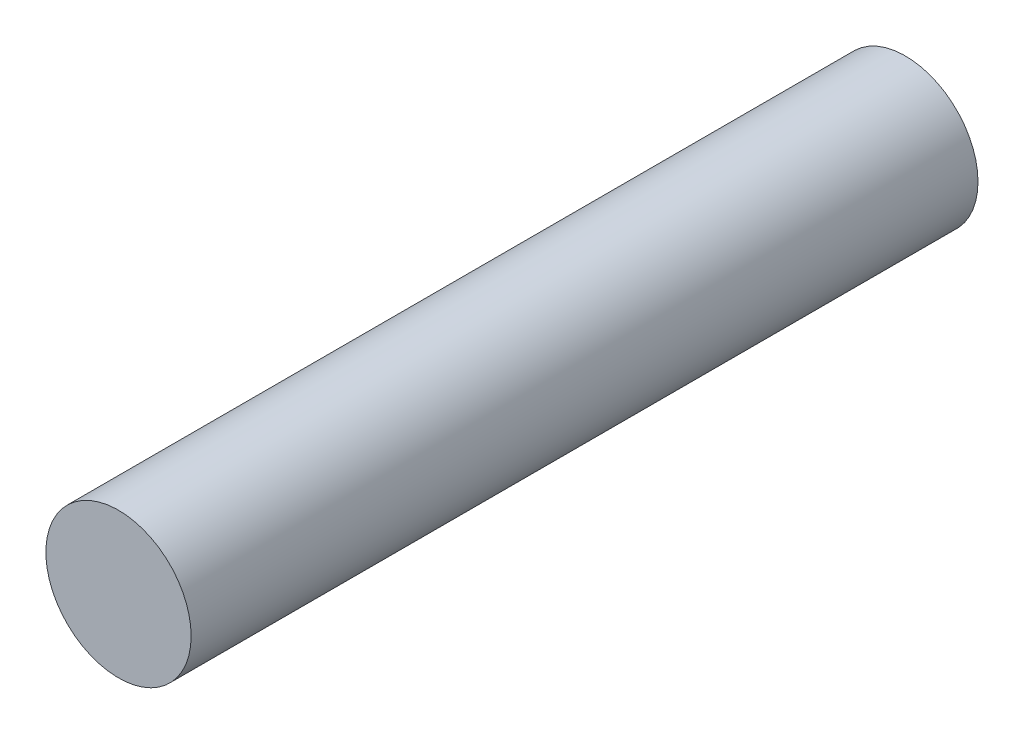
ISO-10303-21;
HEADER;
FILE_DESCRIPTION(('STEP AP214'),'2;1');
FILE_NAME('part.step','',(''),(''),'','','');
FILE_SCHEMA(('AUTOMOTIVE_DESIGN { 1 0 10303 214 1 1 1 1 }'));
ENDSEC;
DATA;
#1=APPLICATION_CONTEXT('core data for automotive mechanical design processes');
#2=APPLICATION_PROTOCOL_DEFINITION('international standard','automotive_design',2000,#1);
#3=PRODUCT_CONTEXT('',#1,'mechanical');
#4=PRODUCT('Part','Part','',(#3));
#5=PRODUCT_RELATED_PRODUCT_CATEGORY('part','',(#4));
#6=PRODUCT_DEFINITION_FORMATION('','',#4);
#7=PRODUCT_DEFINITION_CONTEXT('part definition',#1,'design');
#8=PRODUCT_DEFINITION('design','',#6,#7);
#9=PRODUCT_DEFINITION_SHAPE('','',#8);
#10=(LENGTH_UNIT() NAMED_UNIT(*) SI_UNIT(.MILLI.,.METRE.));
#11=(NAMED_UNIT(*) PLANE_ANGLE_UNIT() SI_UNIT($,.RADIAN.));
#12=(NAMED_UNIT(*) SI_UNIT($,.STERADIAN.) SOLID_ANGLE_UNIT());
#13=UNCERTAINTY_MEASURE_WITH_UNIT(LENGTH_MEASURE(1.E-05),#10,'distance_accuracy_value','');
#14=(GEOMETRIC_REPRESENTATION_CONTEXT(3) GLOBAL_UNCERTAINTY_ASSIGNED_CONTEXT((#13)) GLOBAL_UNIT_ASSIGNED_CONTEXT((#10,
#11,#12)) REPRESENTATION_CONTEXT('',''));
#15=CARTESIAN_POINT('',(0.,0.,0.));
#16=DIRECTION('',(0.,0.,1.));
#17=DIRECTION('',(1.,0.,0.));
#18=AXIS2_PLACEMENT_3D('',#15,#16,#17);
#19=CARTESIAN_POINT('',(0.,0.,32.5));
#20=DIRECTION('',(0.,0.,-1.));
#21=DIRECTION('',(-1.,0.,0.));
#22=AXIS2_PLACEMENT_3D('',#19,#20,#21);
#23=PLANE('',#22);
#24=CARTESIAN_POINT('',(0.,0.,32.5));
#25=DIRECTION('',(0.,0.,1.));
#26=DIRECTION('',(1.,0.,0.));
#27=AXIS2_PLACEMENT_3D('',#24,#25,#26);
#28=CIRCLE('',#27,3.);
#29=CARTESIAN_POINT('',(3.,0.,32.5));
#30=VERTEX_POINT('',#29);
#31=EDGE_CURVE('E18',#30,#30,#28,.F.);
#32=ORIENTED_EDGE('',*,*,#31,.F.);
#33=EDGE_LOOP('',(#32));
#34=FACE_BOUND('',#33,.T.);
#35=ADVANCED_FACE('F15',(#34),#23,.F.);
#36=CARTESIAN_POINT('',(0.,0.,0.));
#37=DIRECTION('',(0.,0.,-1.));
#38=DIRECTION('',(-1.,0.,0.));
#39=AXIS2_PLACEMENT_3D('',#36,#37,#38);
#40=PLANE('',#39);
#41=CARTESIAN_POINT('',(0.,0.,0.));
#42=DIRECTION('',(0.,0.,1.));
#43=DIRECTION('',(1.,0.,0.));
#44=AXIS2_PLACEMENT_3D('',#41,#42,#43);
#45=CIRCLE('',#44,3.);
#46=CARTESIAN_POINT('',(3.,0.,0.));
#47=VERTEX_POINT('',#46);
#48=EDGE_CURVE('E10',#47,#47,#45,.T.);
#49=ORIENTED_EDGE('',*,*,#48,.F.);
#50=EDGE_LOOP('',(#49));
#51=FACE_BOUND('',#50,.T.);
#52=ADVANCED_FACE('F30',(#51),#40,.T.);
#53=CARTESIAN_POINT('',(0.,0.,0.));
#54=DIRECTION('',(0.,0.,1.));
#55=DIRECTION('',(1.,0.,0.));
#56=AXIS2_PLACEMENT_3D('',#53,#54,#55);
#57=CYLINDRICAL_SURFACE('',#56,3.);
#58=ORIENTED_EDGE('',*,*,#48,.T.);
#59=EDGE_LOOP('',(#58));
#60=FACE_BOUND('',#59,.T.);
#61=ORIENTED_EDGE('',*,*,#31,.T.);
#62=EDGE_LOOP('',(#61));
#63=FACE_BOUND('',#62,.T.);
#64=ADVANCED_FACE('F27',(#60,#63),#57,.T.);
#65=CLOSED_SHELL('',(#35,#52,#64));
#66=MANIFOLD_SOLID_BREP('B1',#65);
#67=ADVANCED_BREP_SHAPE_REPRESENTATION('',(#18,#66),#14);
#68=SHAPE_DEFINITION_REPRESENTATION(#9,#67);
ENDSEC;
END-ISO-10303-21;
